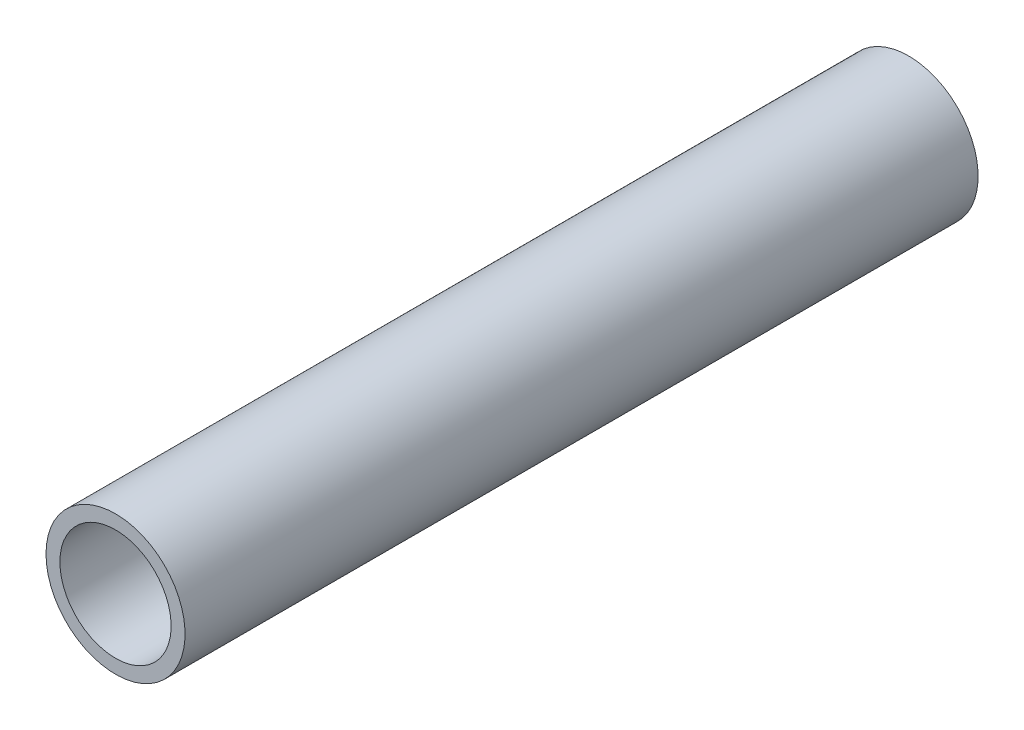
ISO-10303-21;
HEADER;
FILE_DESCRIPTION(('STEP AP214'),'2;1');
FILE_NAME('part.step','',(''),(''),'','','');
FILE_SCHEMA(('AUTOMOTIVE_DESIGN { 1 0 10303 214 1 1 1 1 }'));
ENDSEC;
DATA;
#1=APPLICATION_CONTEXT('core data for automotive mechanical design processes');
#2=APPLICATION_PROTOCOL_DEFINITION('international standard','automotive_design',2000,#1);
#3=PRODUCT_CONTEXT('',#1,'mechanical');
#4=PRODUCT('Part','Part','',(#3));
#5=PRODUCT_RELATED_PRODUCT_CATEGORY('part','',(#4));
#6=PRODUCT_DEFINITION_FORMATION('','',#4);
#7=PRODUCT_DEFINITION_CONTEXT('part definition',#1,'design');
#8=PRODUCT_DEFINITION('design','',#6,#7);
#9=PRODUCT_DEFINITION_SHAPE('','',#8);
#10=(LENGTH_UNIT() NAMED_UNIT(*) SI_UNIT(.MILLI.,.METRE.));
#11=(NAMED_UNIT(*) PLANE_ANGLE_UNIT() SI_UNIT($,.RADIAN.));
#12=(NAMED_UNIT(*) SI_UNIT($,.STERADIAN.) SOLID_ANGLE_UNIT());
#13=UNCERTAINTY_MEASURE_WITH_UNIT(LENGTH_MEASURE(1.E-05),#10,'distance_accuracy_value','');
#14=(GEOMETRIC_REPRESENTATION_CONTEXT(3) GLOBAL_UNCERTAINTY_ASSIGNED_CONTEXT((#13)) GLOBAL_UNIT_ASSIGNED_CONTEXT((#10,
#11,#12)) REPRESENTATION_CONTEXT('',''));
#15=CARTESIAN_POINT('',(0.,0.,0.));
#16=DIRECTION('',(0.,0.,1.));
#17=DIRECTION('',(1.,0.,0.));
#18=AXIS2_PLACEMENT_3D('',#15,#16,#17);
#19=CARTESIAN_POINT('',(0.,0.,14.26));
#20=DIRECTION('',(0.,0.,1.));
#21=DIRECTION('',(1.,0.,0.));
#22=AXIS2_PLACEMENT_3D('',#19,#20,#21);
#23=PLANE('',#22);
#24=CARTESIAN_POINT('',(0.,0.,14.26));
#25=DIRECTION('',(0.,0.,1.));
#26=DIRECTION('',(1.,0.,0.));
#27=AXIS2_PLACEMENT_3D('',#24,#25,#26);
#28=CIRCLE('',#27,1.25);
#29=CARTESIAN_POINT('',(-1.25,0.,14.26));
#30=VERTEX_POINT('',#29);
#31=EDGE_CURVE('E10',#30,#30,#28,.T.);
#32=ORIENTED_EDGE('',*,*,#31,.T.);
#33=EDGE_LOOP('',(#32));
#34=FACE_BOUND('',#33,.T.);
#35=CARTESIAN_POINT('',(0.,0.,14.26));
#36=DIRECTION('',(0.,0.,1.));
#37=DIRECTION('',(1.,0.,0.));
#38=AXIS2_PLACEMENT_3D('',#35,#36,#37);
#39=CIRCLE('',#38,1.);
#40=CARTESIAN_POINT('',(-1.,0.,14.26));
#41=VERTEX_POINT('',#40);
#42=EDGE_CURVE('E42',#41,#41,#39,.T.);
#43=ORIENTED_EDGE('',*,*,#42,.F.);
#44=EDGE_LOOP('',(#43));
#45=FACE_BOUND('',#44,.T.);
#46=ADVANCED_FACE('F31',(#34,#45),#23,.T.);
#47=CARTESIAN_POINT('',(0.,0.,0.));
#48=DIRECTION('',(0.,0.,1.));
#49=DIRECTION('',(1.,0.,0.));
#50=AXIS2_PLACEMENT_3D('',#47,#48,#49);
#51=PLANE('',#50);
#52=CARTESIAN_POINT('',(0.,0.,0.));
#53=DIRECTION('',(0.,0.,1.));
#54=DIRECTION('',(1.,0.,0.));
#55=AXIS2_PLACEMENT_3D('',#52,#53,#54);
#56=CIRCLE('',#55,1.25);
#57=CARTESIAN_POINT('',(-1.25,0.,0.));
#58=VERTEX_POINT('',#57);
#59=EDGE_CURVE('E35',#58,#58,#56,.T.);
#60=ORIENTED_EDGE('',*,*,#59,.F.);
#61=EDGE_LOOP('',(#60));
#62=FACE_BOUND('',#61,.T.);
#63=CARTESIAN_POINT('',(0.,0.,0.));
#64=DIRECTION('',(0.,0.,1.));
#65=DIRECTION('',(1.,0.,0.));
#66=AXIS2_PLACEMENT_3D('',#63,#64,#65);
#67=CIRCLE('',#66,1.);
#68=CARTESIAN_POINT('',(-1.,0.,0.));
#69=VERTEX_POINT('',#68);
#70=EDGE_CURVE('E44',#69,#69,#67,.T.);
#71=ORIENTED_EDGE('',*,*,#70,.T.);
#72=EDGE_LOOP('',(#71));
#73=FACE_BOUND('',#72,.T.);
#74=ADVANCED_FACE('F54',(#62,#73),#51,.F.);
#75=CARTESIAN_POINT('',(0.,0.,14.26));
#76=DIRECTION('',(0.,0.,-1.));
#77=DIRECTION('',(-1.,0.,0.));
#78=AXIS2_PLACEMENT_3D('',#75,#76,#77);
#79=CYLINDRICAL_SURFACE('',#78,1.25);
#80=CARTESIAN_POINT('',(-1.25,0.,14.26));
#81=CARTESIAN_POINT('',(-1.25,0.,14.1114583333333));
#82=CARTESIAN_POINT('',(-1.25,0.,13.9629166666667));
#83=CARTESIAN_POINT('',(-1.25,0.,13.6658333333333));
#84=CARTESIAN_POINT('',(-1.25,0.,13.5172916666667));
#85=CARTESIAN_POINT('',(-1.25,0.,13.2202083333333));
#86=CARTESIAN_POINT('',(-1.25,0.,13.0716666666667));
#87=CARTESIAN_POINT('',(-1.25,0.,12.7745833333333));
#88=CARTESIAN_POINT('',(-1.25,0.,12.6260416666667));
#89=CARTESIAN_POINT('',(-1.25,0.,12.3289583333333));
#90=CARTESIAN_POINT('',(-1.25,0.,12.1804166666667));
#91=CARTESIAN_POINT('',(-1.25,0.,11.8833333333333));
#92=CARTESIAN_POINT('',(-1.25,0.,11.7347916666667));
#93=CARTESIAN_POINT('',(-1.25,0.,11.4377083333333));
#94=CARTESIAN_POINT('',(-1.25,0.,11.2891666666667));
#95=CARTESIAN_POINT('',(-1.25,0.,10.9920833333333));
#96=CARTESIAN_POINT('',(-1.25,0.,10.8435416666667));
#97=CARTESIAN_POINT('',(-1.25,0.,10.5464583333333));
#98=CARTESIAN_POINT('',(-1.25,0.,10.3979166666667));
#99=CARTESIAN_POINT('',(-1.25,0.,10.1008333333333));
#100=CARTESIAN_POINT('',(-1.25,0.,9.95229166666667));
#101=CARTESIAN_POINT('',(-1.25,0.,9.65520833333333));
#102=CARTESIAN_POINT('',(-1.25,0.,9.50666666666666));
#103=CARTESIAN_POINT('',(-1.25,0.,9.20958333333333));
#104=CARTESIAN_POINT('',(-1.25,0.,9.06104166666666));
#105=CARTESIAN_POINT('',(-1.25,0.,8.76395833333333));
#106=CARTESIAN_POINT('',(-1.25,0.,8.61541666666666));
#107=CARTESIAN_POINT('',(-1.25,0.,8.31833333333333));
#108=CARTESIAN_POINT('',(-1.25,0.,8.16979166666666));
#109=CARTESIAN_POINT('',(-1.25,0.,7.87270833333333));
#110=CARTESIAN_POINT('',(-1.25,0.,7.72416666666666));
#111=CARTESIAN_POINT('',(-1.25,0.,7.42708333333333));
#112=CARTESIAN_POINT('',(-1.25,0.,7.27854166666666));
#113=CARTESIAN_POINT('',(-1.25,0.,6.98145833333333));
#114=CARTESIAN_POINT('',(-1.25,0.,6.83291666666666));
#115=CARTESIAN_POINT('',(-1.25,0.,6.53583333333333));
#116=CARTESIAN_POINT('',(-1.25,0.,6.38729166666666));
#117=CARTESIAN_POINT('',(-1.25,0.,6.09020833333333));
#118=CARTESIAN_POINT('',(-1.25,0.,5.94166666666666));
#119=CARTESIAN_POINT('',(-1.25,0.,5.64458333333333));
#120=CARTESIAN_POINT('',(-1.25,0.,5.49604166666666));
#121=CARTESIAN_POINT('',(-1.25,0.,5.19895833333333));
#122=CARTESIAN_POINT('',(-1.25,0.,5.05041666666667));
#123=CARTESIAN_POINT('',(-1.25,0.,4.75333333333333));
#124=CARTESIAN_POINT('',(-1.25,0.,4.60479166666666));
#125=CARTESIAN_POINT('',(-1.25,0.,4.30770833333333));
#126=CARTESIAN_POINT('',(-1.25,0.,4.15916666666666));
#127=CARTESIAN_POINT('',(-1.25,0.,3.86208333333333));
#128=CARTESIAN_POINT('',(-1.25,0.,3.71354166666667));
#129=CARTESIAN_POINT('',(-1.25,0.,3.41645833333333));
#130=CARTESIAN_POINT('',(-1.25,0.,3.26791666666667));
#131=CARTESIAN_POINT('',(-1.25,0.,2.97083333333333));
#132=CARTESIAN_POINT('',(-1.25,0.,2.82229166666667));
#133=CARTESIAN_POINT('',(-1.25,0.,2.52520833333333));
#134=CARTESIAN_POINT('',(-1.25,0.,2.37666666666666));
#135=CARTESIAN_POINT('',(-1.25,0.,2.07958333333333));
#136=CARTESIAN_POINT('',(-1.25,0.,1.93104166666666));
#137=CARTESIAN_POINT('',(-1.25,0.,1.63395833333333));
#138=CARTESIAN_POINT('',(-1.25,0.,1.48541666666666));
#139=CARTESIAN_POINT('',(-1.25,0.,1.18833333333333));
#140=CARTESIAN_POINT('',(-1.25,0.,1.03979166666666));
#141=CARTESIAN_POINT('',(-1.25,0.,0.742708333333331));
#142=CARTESIAN_POINT('',(-1.25,0.,0.594166666666665));
#143=CARTESIAN_POINT('',(-1.25,0.,0.297083333333331));
#144=CARTESIAN_POINT('',(-1.25,0.,0.148541666666665));
#145=CARTESIAN_POINT('',(-1.25,0.,0.));
#146=B_SPLINE_CURVE_WITH_KNOTS('',3,(#80,#81,#82,#83,#84,#85,#86,#87,#88,#89,#90,#91,#92,#93,
#94,#95,#96,#97,#98,#99,#100,#101,#102,#103,#104,#105,#106,#107,#108,#109,#110,#111,#112,#113,
#114,#115,#116,#117,#118,#119,#120,#121,#122,#123,#124,#125,#126,#127,#128,#129,#130,#131,#132,
#133,#134,#135,#136,#137,#138,#139,#140,#141,#142,#143,#144,#145),.UNSPECIFIED.,.F.,.F.,(4,2,2,
2,2,2,2,2,2,2,2,2,2,2,2,2,2,2,2,2,2,2,2,2,2,2,2,2,2,2,2,2,4),(0.,0.445625,0.89125,1.336875,
1.7825,2.228125,2.67375,3.119375,3.565,4.010625,4.45625,4.901875,5.3475,5.793125,6.23875,
6.684375,7.13,7.575625,8.02125,8.466875,8.9125,9.358125,9.80375,10.249375,10.695,11.140625,
11.58625,12.031875,12.4775,12.923125,13.36875,13.814375,14.26),.UNSPECIFIED.);
#147=EDGE_CURVE('BSEAM33',#30,#58,#146,.T.);
#148=ORIENTED_EDGE('',*,*,#31,.F.);
#149=ORIENTED_EDGE('',*,*,#59,.T.);
#150=ORIENTED_EDGE('',*,*,#147,.T.);
#151=ORIENTED_EDGE('',*,*,#147,.F.);
#152=EDGE_LOOP('',(#148,#150,#149,#151));
#153=FACE_BOUND('',#152,.T.);
#154=ADVANCED_FACE('F33',(#153),#79,.T.);
#155=CARTESIAN_POINT('',(0.,0.,14.26));
#156=DIRECTION('',(0.,0.,-1.));
#157=DIRECTION('',(-1.,0.,0.));
#158=AXIS2_PLACEMENT_3D('',#155,#156,#157);
#159=CYLINDRICAL_SURFACE('',#158,1.);
#160=CARTESIAN_POINT('',(-1.,0.,14.26));
#161=CARTESIAN_POINT('',(-1.,0.,14.1114583333333));
#162=CARTESIAN_POINT('',(-1.,0.,13.9629166666667));
#163=CARTESIAN_POINT('',(-1.,0.,13.6658333333333));
#164=CARTESIAN_POINT('',(-1.,0.,13.5172916666667));
#165=CARTESIAN_POINT('',(-1.,0.,13.2202083333333));
#166=CARTESIAN_POINT('',(-1.,0.,13.0716666666667));
#167=CARTESIAN_POINT('',(-1.,0.,12.7745833333333));
#168=CARTESIAN_POINT('',(-1.,0.,12.6260416666667));
#169=CARTESIAN_POINT('',(-1.,0.,12.3289583333333));
#170=CARTESIAN_POINT('',(-1.,0.,12.1804166666667));
#171=CARTESIAN_POINT('',(-1.,0.,11.8833333333333));
#172=CARTESIAN_POINT('',(-1.,0.,11.7347916666667));
#173=CARTESIAN_POINT('',(-1.,0.,11.4377083333333));
#174=CARTESIAN_POINT('',(-1.,0.,11.2891666666667));
#175=CARTESIAN_POINT('',(-1.,0.,10.9920833333333));
#176=CARTESIAN_POINT('',(-1.,0.,10.8435416666667));
#177=CARTESIAN_POINT('',(-1.,0.,10.5464583333333));
#178=CARTESIAN_POINT('',(-1.,0.,10.3979166666667));
#179=CARTESIAN_POINT('',(-1.,0.,10.1008333333333));
#180=CARTESIAN_POINT('',(-1.,0.,9.95229166666667));
#181=CARTESIAN_POINT('',(-1.,0.,9.65520833333333));
#182=CARTESIAN_POINT('',(-1.,0.,9.50666666666666));
#183=CARTESIAN_POINT('',(-1.,0.,9.20958333333333));
#184=CARTESIAN_POINT('',(-1.,0.,9.06104166666666));
#185=CARTESIAN_POINT('',(-1.,0.,8.76395833333333));
#186=CARTESIAN_POINT('',(-1.,0.,8.61541666666666));
#187=CARTESIAN_POINT('',(-1.,0.,8.31833333333333));
#188=CARTESIAN_POINT('',(-1.,0.,8.16979166666666));
#189=CARTESIAN_POINT('',(-1.,0.,7.87270833333333));
#190=CARTESIAN_POINT('',(-1.,0.,7.72416666666666));
#191=CARTESIAN_POINT('',(-1.,0.,7.42708333333333));
#192=CARTESIAN_POINT('',(-1.,0.,7.27854166666666));
#193=CARTESIAN_POINT('',(-1.,0.,6.98145833333333));
#194=CARTESIAN_POINT('',(-1.,0.,6.83291666666666));
#195=CARTESIAN_POINT('',(-1.,0.,6.53583333333333));
#196=CARTESIAN_POINT('',(-1.,0.,6.38729166666667));
#197=CARTESIAN_POINT('',(-1.,0.,6.09020833333333));
#198=CARTESIAN_POINT('',(-1.,0.,5.94166666666667));
#199=CARTESIAN_POINT('',(-1.,0.,5.64458333333333));
#200=CARTESIAN_POINT('',(-1.,0.,5.49604166666667));
#201=CARTESIAN_POINT('',(-1.,0.,5.19895833333333));
#202=CARTESIAN_POINT('',(-1.,0.,5.05041666666667));
#203=CARTESIAN_POINT('',(-1.,0.,4.75333333333333));
#204=CARTESIAN_POINT('',(-1.,0.,4.60479166666666));
#205=CARTESIAN_POINT('',(-1.,0.,4.30770833333333));
#206=CARTESIAN_POINT('',(-1.,0.,4.15916666666666));
#207=CARTESIAN_POINT('',(-1.,0.,3.86208333333333));
#208=CARTESIAN_POINT('',(-1.,0.,3.71354166666667));
#209=CARTESIAN_POINT('',(-1.,0.,3.41645833333333));
#210=CARTESIAN_POINT('',(-1.,0.,3.26791666666667));
#211=CARTESIAN_POINT('',(-1.,0.,2.97083333333333));
#212=CARTESIAN_POINT('',(-1.,0.,2.82229166666667));
#213=CARTESIAN_POINT('',(-1.,0.,2.52520833333333));
#214=CARTESIAN_POINT('',(-1.,0.,2.37666666666667));
#215=CARTESIAN_POINT('',(-1.,0.,2.07958333333333));
#216=CARTESIAN_POINT('',(-1.,0.,1.93104166666666));
#217=CARTESIAN_POINT('',(-1.,0.,1.63395833333333));
#218=CARTESIAN_POINT('',(-1.,0.,1.48541666666666));
#219=CARTESIAN_POINT('',(-1.,0.,1.18833333333333));
#220=CARTESIAN_POINT('',(-1.,0.,1.03979166666666));
#221=CARTESIAN_POINT('',(-1.,0.,0.742708333333331));
#222=CARTESIAN_POINT('',(-1.,0.,0.594166666666665));
#223=CARTESIAN_POINT('',(-1.,0.,0.297083333333331));
#224=CARTESIAN_POINT('',(-1.,0.,0.148541666666665));
#225=CARTESIAN_POINT('',(-1.,0.,0.));
#226=B_SPLINE_CURVE_WITH_KNOTS('',3,(#160,#161,#162,#163,#164,#165,#166,#167,#168,#169,#170,
#171,#172,#173,#174,#175,#176,#177,#178,#179,#180,#181,#182,#183,#184,#185,#186,#187,#188,#189,
#190,#191,#192,#193,#194,#195,#196,#197,#198,#199,#200,#201,#202,#203,#204,#205,#206,#207,#208,
#209,#210,#211,#212,#213,#214,#215,#216,#217,#218,#219,#220,#221,#222,#223,#224,#225),
.UNSPECIFIED.,.F.,.F.,(4,2,2,2,2,2,2,2,2,2,2,2,2,2,2,2,2,2,2,2,2,2,2,2,2,2,2,2,2,2,2,2,4),(0.,
0.445625000000002,0.891250000000001,1.336875,1.7825,2.228125,2.67375,3.119375,3.565,4.010625,
4.45625,4.901875,5.3475,5.793125,6.23875,6.684375,7.13,7.575625,8.02125,8.466875,8.9125,
9.358125,9.80375,10.249375,10.695,11.140625,11.58625,12.031875,12.4775,12.923125,13.36875,
13.814375,14.26),.UNSPECIFIED.);
#227=EDGE_CURVE('BSEAM50',#41,#69,#226,.T.);
#228=ORIENTED_EDGE('',*,*,#42,.T.);
#229=ORIENTED_EDGE('',*,*,#70,.F.);
#230=ORIENTED_EDGE('',*,*,#227,.T.);
#231=ORIENTED_EDGE('',*,*,#227,.F.);
#232=EDGE_LOOP('',(#228,#230,#229,#231));
#233=FACE_BOUND('',#232,.T.);
#234=ADVANCED_FACE('F50',(#233),#159,.F.);
#235=CLOSED_SHELL('',(#46,#74,#154,#234));
#236=MANIFOLD_SOLID_BREP('B2',#235);
#237=ADVANCED_BREP_SHAPE_REPRESENTATION('',(#18,#236),#14);
#238=SHAPE_DEFINITION_REPRESENTATION(#9,#237);
ENDSEC;
END-ISO-10303-21;
